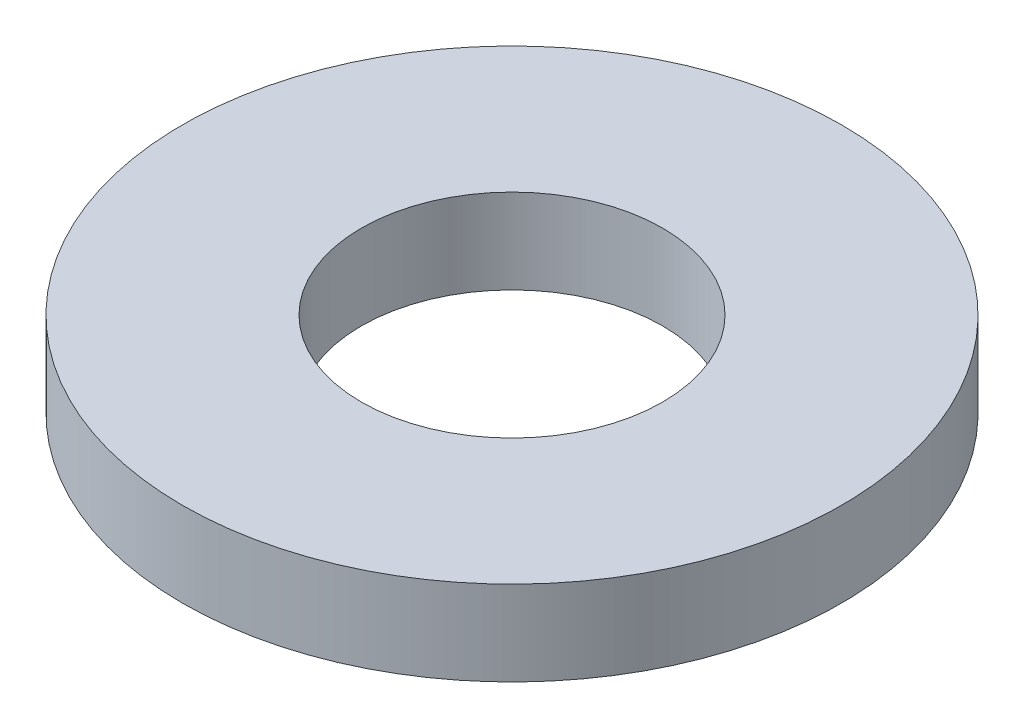
ISO-10303-21;
HEADER;
FILE_DESCRIPTION(('STEP AP214'),'2;1');
FILE_NAME('part.step','',(''),(''),'','','');
FILE_SCHEMA(('AUTOMOTIVE_DESIGN { 1 0 10303 214 1 1 1 1 }'));
ENDSEC;
DATA;
#1=APPLICATION_CONTEXT('core data for automotive mechanical design processes');
#2=APPLICATION_PROTOCOL_DEFINITION('international standard','automotive_design',2000,#1);
#3=PRODUCT_CONTEXT('',#1,'mechanical');
#4=PRODUCT('Part','Part','',(#3));
#5=PRODUCT_RELATED_PRODUCT_CATEGORY('part','',(#4));
#6=PRODUCT_DEFINITION_FORMATION('','',#4);
#7=PRODUCT_DEFINITION_CONTEXT('part definition',#1,'design');
#8=PRODUCT_DEFINITION('design','',#6,#7);
#9=PRODUCT_DEFINITION_SHAPE('','',#8);
#10=(LENGTH_UNIT() NAMED_UNIT(*) SI_UNIT(.MILLI.,.METRE.));
#11=(NAMED_UNIT(*) PLANE_ANGLE_UNIT() SI_UNIT($,.RADIAN.));
#12=(NAMED_UNIT(*) SI_UNIT($,.STERADIAN.) SOLID_ANGLE_UNIT());
#13=UNCERTAINTY_MEASURE_WITH_UNIT(LENGTH_MEASURE(1.E-05),#10,'distance_accuracy_value','');
#14=(GEOMETRIC_REPRESENTATION_CONTEXT(3) GLOBAL_UNCERTAINTY_ASSIGNED_CONTEXT((#13)) GLOBAL_UNIT_ASSIGNED_CONTEXT((#10,
#11,#12)) REPRESENTATION_CONTEXT('',''));
#15=CARTESIAN_POINT('',(0.,0.,0.));
#16=DIRECTION('',(0.,0.,1.));
#17=DIRECTION('',(1.,0.,0.));
#18=AXIS2_PLACEMENT_3D('',#15,#16,#17);
#19=CARTESIAN_POINT('',(0.,0.9,0.));
#20=DIRECTION('',(0.,1.,0.));
#21=DIRECTION('',(0.,0.,1.));
#22=AXIS2_PLACEMENT_3D('',#19,#20,#21);
#23=PLANE('',#22);
#24=CARTESIAN_POINT('',(0.,0.9,0.));
#25=DIRECTION('',(0.,1.,0.));
#26=DIRECTION('',(0.,0.,1.));
#27=AXIS2_PLACEMENT_3D('',#24,#25,#26);
#28=CIRCLE('',#27,3.5);
#29=CARTESIAN_POINT('',(0.,0.9,3.5));
#30=VERTEX_POINT('',#29);
#31=EDGE_CURVE('E10',#30,#30,#28,.T.);
#32=ORIENTED_EDGE('',*,*,#31,.T.);
#33=EDGE_LOOP('',(#32));
#34=FACE_BOUND('',#33,.T.);
#35=CARTESIAN_POINT('',(0.,0.9,0.));
#36=DIRECTION('',(0.,1.,0.));
#37=DIRECTION('',(0.,0.,1.));
#38=AXIS2_PLACEMENT_3D('',#35,#36,#37);
#39=CIRCLE('',#38,1.6);
#40=CARTESIAN_POINT('',(0.,0.9,1.6));
#41=VERTEX_POINT('',#40);
#42=EDGE_CURVE('E37',#41,#41,#39,.T.);
#43=ORIENTED_EDGE('',*,*,#42,.F.);
#44=EDGE_LOOP('',(#43));
#45=FACE_BOUND('',#44,.T.);
#46=ADVANCED_FACE('F26',(#34,#45),#23,.T.);
#47=CARTESIAN_POINT('',(0.,0.,0.));
#48=DIRECTION('',(0.,1.,0.));
#49=DIRECTION('',(0.,0.,1.));
#50=AXIS2_PLACEMENT_3D('',#47,#48,#49);
#51=PLANE('',#50);
#52=CARTESIAN_POINT('',(0.,0.,0.));
#53=DIRECTION('',(0.,1.,0.));
#54=DIRECTION('',(0.,0.,1.));
#55=AXIS2_PLACEMENT_3D('',#52,#53,#54);
#56=CIRCLE('',#55,3.5);
#57=CARTESIAN_POINT('',(0.,0.,3.5));
#58=VERTEX_POINT('',#57);
#59=EDGE_CURVE('E33',#58,#58,#56,.T.);
#60=ORIENTED_EDGE('',*,*,#59,.F.);
#61=EDGE_LOOP('',(#60));
#62=FACE_BOUND('',#61,.T.);
#63=CARTESIAN_POINT('',(0.,0.,0.));
#64=DIRECTION('',(0.,1.,0.));
#65=DIRECTION('',(0.,0.,1.));
#66=AXIS2_PLACEMENT_3D('',#63,#64,#65);
#67=CIRCLE('',#66,1.6);
#68=CARTESIAN_POINT('',(0.,0.,1.6));
#69=VERTEX_POINT('',#68);
#70=EDGE_CURVE('E41',#69,#69,#67,.T.);
#71=ORIENTED_EDGE('',*,*,#70,.T.);
#72=EDGE_LOOP('',(#71));
#73=FACE_BOUND('',#72,.T.);
#74=ADVANCED_FACE('F47',(#62,#73),#51,.F.);
#75=CARTESIAN_POINT('',(0.,0.9,0.));
#76=DIRECTION('',(0.,-1.,0.));
#77=DIRECTION('',(0.,0.,-1.));
#78=AXIS2_PLACEMENT_3D('',#75,#76,#77);
#79=CYLINDRICAL_SURFACE('',#78,3.5);
#80=ORIENTED_EDGE('',*,*,#31,.F.);
#81=EDGE_LOOP('',(#80));
#82=FACE_BOUND('',#81,.T.);
#83=ORIENTED_EDGE('',*,*,#59,.T.);
#84=EDGE_LOOP('',(#83));
#85=FACE_BOUND('',#84,.T.);
#86=ADVANCED_FACE('F28',(#82,#85),#79,.T.);
#87=CARTESIAN_POINT('',(0.,0.9,0.));
#88=DIRECTION('',(0.,-1.,0.));
#89=DIRECTION('',(0.,0.,-1.));
#90=AXIS2_PLACEMENT_3D('',#87,#88,#89);
#91=CYLINDRICAL_SURFACE('',#90,1.6);
#92=ORIENTED_EDGE('',*,*,#42,.T.);
#93=EDGE_LOOP('',(#92));
#94=FACE_BOUND('',#93,.T.);
#95=ORIENTED_EDGE('',*,*,#70,.F.);
#96=EDGE_LOOP('',(#95));
#97=FACE_BOUND('',#96,.T.);
#98=ADVANCED_FACE('F49',(#94,#97),#91,.F.);
#99=CLOSED_SHELL('',(#46,#74,#86,#98));
#100=MANIFOLD_SOLID_BREP('B2',#99);
#101=ADVANCED_BREP_SHAPE_REPRESENTATION('',(#18,#100),#14);
#102=SHAPE_DEFINITION_REPRESENTATION(#9,#101);
ENDSEC;
END-ISO-10303-21;
